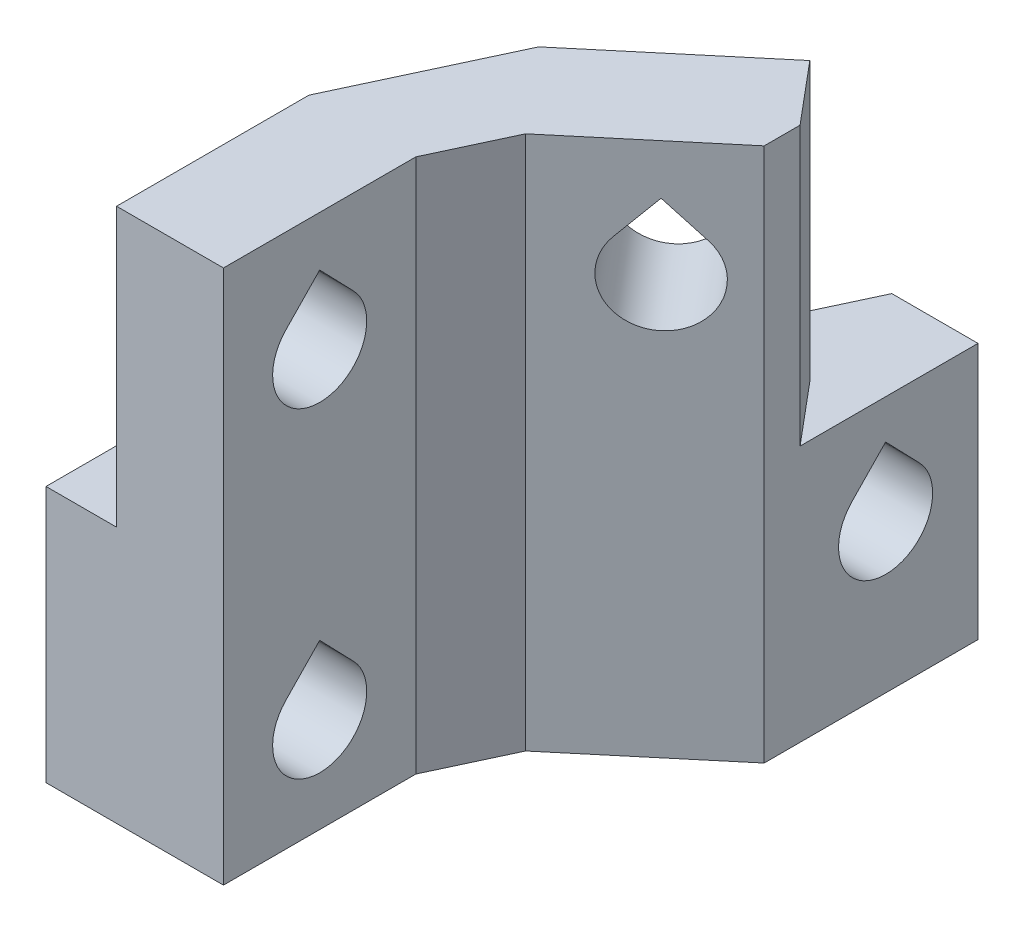
ISO-10303-21;
HEADER;
FILE_DESCRIPTION(('STEP AP214'),'2;1');
FILE_NAME('part.step','',(''),(''),'','','');
FILE_SCHEMA(('AUTOMOTIVE_DESIGN { 1 0 10303 214 1 1 1 1 }'));
ENDSEC;
DATA;
#1=APPLICATION_CONTEXT('core data for automotive mechanical design processes');
#2=APPLICATION_PROTOCOL_DEFINITION('international standard','automotive_design',2000,#1);
#3=PRODUCT_CONTEXT('',#1,'mechanical');
#4=PRODUCT('Part','Part','',(#3));
#5=PRODUCT_RELATED_PRODUCT_CATEGORY('part','',(#4));
#6=PRODUCT_DEFINITION_FORMATION('','',#4);
#7=PRODUCT_DEFINITION_CONTEXT('part definition',#1,'design');
#8=PRODUCT_DEFINITION('design','',#6,#7);
#9=PRODUCT_DEFINITION_SHAPE('','',#8);
#10=(LENGTH_UNIT() NAMED_UNIT(*) SI_UNIT(.MILLI.,.METRE.));
#11=(NAMED_UNIT(*) PLANE_ANGLE_UNIT() SI_UNIT($,.RADIAN.));
#12=(NAMED_UNIT(*) SI_UNIT($,.STERADIAN.) SOLID_ANGLE_UNIT());
#13=UNCERTAINTY_MEASURE_WITH_UNIT(LENGTH_MEASURE(1.E-05),#10,'distance_accuracy_value','');
#14=(GEOMETRIC_REPRESENTATION_CONTEXT(3) GLOBAL_UNCERTAINTY_ASSIGNED_CONTEXT((#13)) GLOBAL_UNIT_ASSIGNED_CONTEXT((#10,
#11,#12)) REPRESENTATION_CONTEXT('',''));
#15=CARTESIAN_POINT('',(0.,0.,0.));
#16=DIRECTION('',(0.,0.,1.));
#17=DIRECTION('',(1.,0.,0.));
#18=AXIS2_PLACEMENT_3D('',#15,#16,#17);
#19=CARTESIAN_POINT('',(16.,-5.,14.9999999999996));
#20=DIRECTION('',(0.,-1.,0.));
#21=DIRECTION('',(0.,0.,-1.));
#22=AXIS2_PLACEMENT_3D('',#19,#20,#21);
#23=PLANE('',#22);
#24=DIRECTION('',(-0.766044443118978,0.,0.64278760968654));
#25=VECTOR('',#24,1.);
#26=CARTESIAN_POINT('',(6.71746577067944,-5.,-1.32877899582662));
#27=LINE('',#26,#25);
#28=CARTESIAN_POINT('',(13.6118657587502,-5.,-7.11386748300547));
#29=VERTEX_POINT('',#28);
#30=CARTESIAN_POINT('',(6.71746577067944,-5.,-1.32877899582662));
#31=VERTEX_POINT('',#30);
#32=EDGE_CURVE('E404',#29,#31,#27,.T.);
#33=ORIENTED_EDGE('',*,*,#32,.F.);
#34=DIRECTION('',(-0.642787609686539,0.,-0.766044443118978));
#35=VECTOR('',#34,1.);
#36=CARTESIAN_POINT('',(13.6118657587502,-5.,-7.11386748300547));
#37=LINE('',#36,#35);
#38=CARTESIAN_POINT('',(16.,-5.,-4.26779992139882));
#39=VERTEX_POINT('',#38);
#40=EDGE_CURVE('E334',#39,#29,#37,.T.);
#41=ORIENTED_EDGE('',*,*,#40,.F.);
#42=DIRECTION('',(0.,0.,1.));
#43=VECTOR('',#42,1.);
#44=CARTESIAN_POINT('',(16.,-5.,-12.5907135973796));
#45=LINE('',#44,#43);
#46=CARTESIAN_POINT('',(16.,-5.,-12.5907135973796));
#47=VERTEX_POINT('',#46);
#48=EDGE_CURVE('E386',#47,#39,#45,.T.);
#49=ORIENTED_EDGE('',*,*,#48,.F.);
#50=DIRECTION('',(1.,0.,0.));
#51=VECTOR('',#50,1.);
#52=CARTESIAN_POINT('',(11.9689921210243,-5.,-12.5907135973796));
#53=LINE('',#52,#51);
#54=CARTESIAN_POINT('',(11.9689921210243,-5.,-12.5907135973796));
#55=VERTEX_POINT('',#54);
#56=EDGE_CURVE('E381',#55,#47,#53,.T.);
#57=ORIENTED_EDGE('',*,*,#56,.F.);
#58=DIRECTION('',(0.422618261740698,0.,-0.906307787036651));
#59=VECTOR('',#58,1.);
#60=CARTESIAN_POINT('',(3.3,-5.,5.99999999999999));
#61=LINE('',#60,#59);
#62=EDGE_CURVE('E417',#31,#55,#61,.T.);
#63=ORIENTED_EDGE('',*,*,#62,.F.);
#64=EDGE_LOOP('',(#33,#41,#49,#57,#63));
#65=FACE_BOUND('',#64,.T.);
#66=ADVANCED_FACE('F30',(#65),#23,.F.);
#67=CARTESIAN_POINT('',(16.,-5.,-12.5907135973796));
#68=DIRECTION('',(1.,0.,0.));
#69=DIRECTION('',(0.,0.,-1.));
#70=AXIS2_PLACEMENT_3D('',#67,#68,#69);
#71=PLANE('',#70);
#72=CARTESIAN_POINT('',(16.,-10.,-8.26977078028226));
#73=DIRECTION('',(1.,0.,0.));
#74=DIRECTION('',(0.,0.,-1.));
#75=AXIS2_PLACEMENT_3D('',#72,#73,#74);
#76=CIRCLE('',#75,2.2);
#77=CARTESIAN_POINT('',(16.,-8.47175158499021,-6.68722321953723));
#78=VERTEX_POINT('',#77);
#79=CARTESIAN_POINT('',(16.,-8.47175158499021,-9.85231834102729));
#80=VERTEX_POINT('',#79);
#81=EDGE_CURVE('E219',#78,#80,#76,.T.);
#82=ORIENTED_EDGE('',*,*,#81,.F.);
#83=DIRECTION('',(0.,-0.71933980033865,0.694658370458998));
#84=VECTOR('',#83,1.);
#85=CARTESIAN_POINT('',(16.,-6.83297561282341,-8.26977078028226));
#86=LINE('',#85,#84);
#87=CARTESIAN_POINT('',(16.,-6.83297561282341,-8.26977078028226));
#88=VERTEX_POINT('',#87);
#89=EDGE_CURVE('E204',#88,#78,#86,.T.);
#90=ORIENTED_EDGE('',*,*,#89,.F.);
#91=DIRECTION('',(0.,0.71933980033865,0.694658370458998));
#92=VECTOR('',#91,1.);
#93=CARTESIAN_POINT('',(16.,-8.47175158499021,-9.85231834102729));
#94=LINE('',#93,#92);
#95=EDGE_CURVE('E215',#80,#88,#94,.T.);
#96=ORIENTED_EDGE('',*,*,#95,.F.);
#97=EDGE_LOOP('',(#82,#90,#96));
#98=FACE_BOUND('',#97,.T.);
#99=DIRECTION('',(0.,-1.,0.));
#100=VECTOR('',#99,1.);
#101=CARTESIAN_POINT('',(16.,8.000025,-2.59071359737859));
#102=LINE('',#101,#100);
#103=CARTESIAN_POINT('',(16.,8.,-2.59071359737859));
#104=VERTEX_POINT('',#103);
#105=CARTESIAN_POINT('',(16.,-17.,-2.59071359737859));
#106=VERTEX_POINT('',#105);
#107=EDGE_CURVE('E296',#104,#106,#102,.T.);
#108=ORIENTED_EDGE('',*,*,#107,.T.);
#109=DIRECTION('',(0.,0.,1.));
#110=VECTOR('',#109,1.);
#111=CARTESIAN_POINT('',(16.,-17.,-12.5907135973796));
#112=LINE('',#111,#110);
#113=CARTESIAN_POINT('',(16.,-17.,-12.5907135973796));
#114=VERTEX_POINT('',#113);
#115=EDGE_CURVE('E368',#114,#106,#112,.T.);
#116=ORIENTED_EDGE('',*,*,#115,.F.);
#117=DIRECTION('',(0.,-1.,0.));
#118=VECTOR('',#117,1.);
#119=CARTESIAN_POINT('',(16.,-5.,-12.5907135973796));
#120=LINE('',#119,#118);
#121=EDGE_CURVE('E340',#47,#114,#120,.T.);
#122=ORIENTED_EDGE('',*,*,#121,.F.);
#123=ORIENTED_EDGE('',*,*,#48,.T.);
#124=DIRECTION('',(0.,-1.,0.));
#125=VECTOR('',#124,1.);
#126=CARTESIAN_POINT('',(16.,8.,-4.26779992139882));
#127=LINE('',#126,#125);
#128=CARTESIAN_POINT('',(16.,8.,-4.26779992139882));
#129=VERTEX_POINT('',#128);
#130=EDGE_CURVE('E373',#129,#39,#127,.T.);
#131=ORIENTED_EDGE('',*,*,#130,.F.);
#132=DIRECTION('',(0.,0.,-1.));
#133=VECTOR('',#132,1.);
#134=CARTESIAN_POINT('',(16.,8.,-4.26779992139882));
#135=LINE('',#134,#133);
#136=EDGE_CURVE('E408',#104,#129,#135,.T.);
#137=ORIENTED_EDGE('',*,*,#136,.F.);
#138=EDGE_LOOP('',(#108,#116,#122,#123,#131,#137));
#139=FACE_BOUND('',#138,.T.);
#140=ADVANCED_FACE('F221',(#98,#139),#71,.T.);
#141=CARTESIAN_POINT('',(11.9689921210243,-5.,-12.5907135973796));
#142=DIRECTION('',(0.,0.,-1.));
#143=DIRECTION('',(-1.,0.,0.));
#144=AXIS2_PLACEMENT_3D('',#141,#142,#143);
#145=PLANE('',#144);
#146=DIRECTION('',(1.,0.,0.));
#147=VECTOR('',#146,1.);
#148=CARTESIAN_POINT('',(11.9689921210243,-17.,-12.5907135973796));
#149=LINE('',#148,#147);
#150=CARTESIAN_POINT('',(11.9689921210243,-17.,-12.5907135973796));
#151=VERTEX_POINT('',#150);
#152=EDGE_CURVE('E371',#151,#114,#149,.T.);
#153=ORIENTED_EDGE('',*,*,#152,.F.);
#154=DIRECTION('',(0.,-1.,0.));
#155=VECTOR('',#154,1.);
#156=CARTESIAN_POINT('',(11.9689921210243,-5.,-12.5907135973796));
#157=LINE('',#156,#155);
#158=EDGE_CURVE('E388',#55,#151,#157,.T.);
#159=ORIENTED_EDGE('',*,*,#158,.F.);
#160=ORIENTED_EDGE('',*,*,#56,.T.);
#161=ORIENTED_EDGE('',*,*,#121,.T.);
#162=EDGE_LOOP('',(#153,#159,#160,#161));
#163=FACE_BOUND('',#162,.T.);
#164=ADVANCED_FACE('F470',(#163),#145,.T.);
#165=CARTESIAN_POINT('',(3.3,-5.,5.99999999999999));
#166=DIRECTION('',(-0.906307787036651,0.,-0.422618261740698));
#167=DIRECTION('',(-0.422618261740698,0.,0.906307787036651));
#168=AXIS2_PLACEMENT_3D('',#165,#166,#167);
#169=PLANE('',#168);
#170=CARTESIAN_POINT('',(9.95410339496202,-10.,-8.26977078028226));
#171=DIRECTION('',(-0.906307787036651,0.,-0.422618261740698));
#172=DIRECTION('',(0.422618261740698,0.,-0.906307787036651));
#173=AXIS2_PLACEMENT_3D('',#170,#171,#172);
#174=ELLIPSE('',#173,2.42743142171748,2.2);
#175=CARTESIAN_POINT('',(10.6920574419319,-8.47175158499021,-9.85231834102729));
#176=VERTEX_POINT('',#175);
#177=CARTESIAN_POINT('',(9.2161493479921,-8.4717515849902,-6.68722321953723));
#178=VERTEX_POINT('',#177);
#179=EDGE_CURVE('E352',#176,#178,#174,.T.);
#180=ORIENTED_EDGE('',*,*,#179,.F.);
#181=DIRECTION('',(0.308160528121496,-0.684332677799278,-0.66085238518443));
#182=VECTOR('',#181,1.);
#183=CARTESIAN_POINT('',(6.02964542374726,1.88207575577133,0.146256498236737));
#184=LINE('',#183,#182);
#185=CARTESIAN_POINT('',(9.95410339496202,-6.83297561282341,-8.26977078028225));
#186=VERTEX_POINT('',#185);
#187=EDGE_CURVE('E342',#186,#176,#184,.T.);
#188=ORIENTED_EDGE('',*,*,#187,.F.);
#189=DIRECTION('',(0.308160528121496,0.684332677799278,-0.66085238518443));
#190=VECTOR('',#189,1.);
#191=CARTESIAN_POINT('',(6.8027370529266,-13.8312209128229,-1.51164385072638));
#192=LINE('',#191,#190);
#193=EDGE_CURVE('E207',#178,#186,#192,.T.);
#194=ORIENTED_EDGE('',*,*,#193,.F.);
#195=EDGE_LOOP('',(#180,#188,#194));
#196=FACE_BOUND('',#195,.T.);
#197=DIRECTION('',(0.422618261740698,0.,-0.906307787036651));
#198=VECTOR('',#197,1.);
#199=CARTESIAN_POINT('',(3.3,-17.,5.99999999999999));
#200=LINE('',#199,#198);
#201=CARTESIAN_POINT('',(3.3,-17.,5.99999999999999));
#202=VERTEX_POINT('',#201);
#203=EDGE_CURVE('E375',#202,#151,#200,.T.);
#204=ORIENTED_EDGE('',*,*,#203,.F.);
#205=DIRECTION('',(0.,-1.,0.));
#206=VECTOR('',#205,1.);
#207=CARTESIAN_POINT('',(3.3,-17.,5.99999999999999));
#208=LINE('',#207,#206);
#209=CARTESIAN_POINT('',(3.3,-5.,5.99999999999999));
#210=VERTEX_POINT('',#209);
#211=EDGE_CURVE('E305',#210,#202,#208,.T.);
#212=ORIENTED_EDGE('',*,*,#211,.F.);
#213=DIRECTION('',(0.,-1.,0.));
#214=VECTOR('',#213,1.);
#215=CARTESIAN_POINT('',(3.3,-5.,5.99999999999999));
#216=LINE('',#215,#214);
#217=CARTESIAN_POINT('',(3.3,8.,6.));
#218=VERTEX_POINT('',#217);
#219=EDGE_CURVE('E319',#218,#210,#216,.T.);
#220=ORIENTED_EDGE('',*,*,#219,.F.);
#221=DIRECTION('',(-0.422618261740698,0.,0.906307787036651));
#222=VECTOR('',#221,1.);
#223=CARTESIAN_POINT('',(3.3,8.,6.));
#224=LINE('',#223,#222);
#225=CARTESIAN_POINT('',(6.71746577067944,8.,-1.32877899582662));
#226=VERTEX_POINT('',#225);
#227=EDGE_CURVE('E438',#226,#218,#224,.T.);
#228=ORIENTED_EDGE('',*,*,#227,.F.);
#229=DIRECTION('',(0.,-1.,0.));
#230=VECTOR('',#229,1.);
#231=CARTESIAN_POINT('',(6.71746577067944,8.,-1.32877899582662));
#232=LINE('',#231,#230);
#233=EDGE_CURVE('E400',#226,#31,#232,.T.);
#234=ORIENTED_EDGE('',*,*,#233,.T.);
#235=ORIENTED_EDGE('',*,*,#62,.T.);
#236=ORIENTED_EDGE('',*,*,#158,.T.);
#237=EDGE_LOOP('',(#204,#212,#220,#228,#234,#235,#236));
#238=FACE_BOUND('',#237,.T.);
#239=ADVANCED_FACE('F473',(#196,#238),#169,.T.);
#240=CARTESIAN_POINT('',(3.3,-5.,14.9999999999996));
#241=DIRECTION('',(-1.,0.,0.));
#242=DIRECTION('',(0.,0.,1.));
#243=AXIS2_PLACEMENT_3D('',#240,#241,#242);
#244=PLANE('',#243);
#245=CARTESIAN_POINT('',(3.3,2.5,10.5));
#246=DIRECTION('',(-1.,0.,0.));
#247=DIRECTION('',(0.,0.,1.));
#248=AXIS2_PLACEMENT_3D('',#245,#246,#247);
#249=CIRCLE('',#248,2.2);
#250=CARTESIAN_POINT('',(3.3,4.02824841500962,8.91745243925479));
#251=VERTEX_POINT('',#250);
#252=CARTESIAN_POINT('',(3.3,4.0282484150098,12.082547560745));
#253=VERTEX_POINT('',#252);
#254=EDGE_CURVE('E272',#251,#253,#249,.T.);
#255=ORIENTED_EDGE('',*,*,#254,.F.);
#256=DIRECTION('',(0.,-0.719339800338728,-0.694658370458918));
#257=VECTOR('',#256,1.);
#258=CARTESIAN_POINT('',(3.3,2.39600466316718,7.34121297035192));
#259=LINE('',#258,#257);
#260=CARTESIAN_POINT('',(3.3,5.66702438717678,10.4999999999998));
#261=VERTEX_POINT('',#260);
#262=EDGE_CURVE('E263',#261,#251,#259,.T.);
#263=ORIENTED_EDGE('',*,*,#262,.F.);
#264=DIRECTION('',(0.,0.719339800338651,-0.694658370458997));
#265=VECTOR('',#264,1.);
#266=CARTESIAN_POINT('',(3.3,-2.10125405841737,18.0017392944858));
#267=LINE('',#266,#265);
#268=EDGE_CURVE('E269',#253,#261,#267,.T.);
#269=ORIENTED_EDGE('',*,*,#268,.F.);
#270=EDGE_LOOP('',(#255,#263,#269));
#271=FACE_BOUND('',#270,.T.);
#272=DIRECTION('',(0.,0.,-1.));
#273=VECTOR('',#272,1.);
#274=CARTESIAN_POINT('',(3.3,-5.,5.99999999999999));
#275=LINE('',#274,#273);
#276=CARTESIAN_POINT('',(3.3,-5.,14.9999999999996));
#277=VERTEX_POINT('',#276);
#278=EDGE_CURVE('E299',#277,#210,#275,.T.);
#279=ORIENTED_EDGE('',*,*,#278,.F.);
#280=DIRECTION('',(0.,-1.,0.));
#281=VECTOR('',#280,1.);
#282=CARTESIAN_POINT('',(3.3,-5.,14.9999999999996));
#283=LINE('',#282,#281);
#284=CARTESIAN_POINT('',(3.3,8.,14.9999999999996));
#285=VERTEX_POINT('',#284);
#286=EDGE_CURVE('E395',#285,#277,#283,.T.);
#287=ORIENTED_EDGE('',*,*,#286,.F.);
#288=DIRECTION('',(0.,0.,1.));
#289=VECTOR('',#288,1.);
#290=CARTESIAN_POINT('',(3.3,8.,14.9999999999996));
#291=LINE('',#290,#289);
#292=EDGE_CURVE('E441',#218,#285,#291,.T.);
#293=ORIENTED_EDGE('',*,*,#292,.F.);
#294=ORIENTED_EDGE('',*,*,#219,.T.);
#295=EDGE_LOOP('',(#279,#287,#293,#294));
#296=FACE_BOUND('',#295,.T.);
#297=ADVANCED_FACE('F475',(#271,#296),#244,.T.);
#298=CARTESIAN_POINT('',(16.,-5.,14.9999999999996));
#299=DIRECTION('',(0.,0.,1.));
#300=DIRECTION('',(1.,0.,0.));
#301=AXIS2_PLACEMENT_3D('',#298,#299,#300);
#302=PLANE('',#301);
#303=DIRECTION('',(0.,-1.,0.));
#304=VECTOR('',#303,1.);
#305=CARTESIAN_POINT('',(8.3,8.000025,14.9999999999996));
#306=LINE('',#305,#304);
#307=CARTESIAN_POINT('',(8.3,8.,14.9999999999996));
#308=VERTEX_POINT('',#307);
#309=CARTESIAN_POINT('',(8.3,-17.,14.9999999999996));
#310=VERTEX_POINT('',#309);
#311=EDGE_CURVE('E295',#308,#310,#306,.T.);
#312=ORIENTED_EDGE('',*,*,#311,.F.);
#313=DIRECTION('',(1.,0.,0.));
#314=VECTOR('',#313,1.);
#315=CARTESIAN_POINT('',(16.,8.,14.9999999999996));
#316=LINE('',#315,#314);
#317=EDGE_CURVE('E403',#285,#308,#316,.T.);
#318=ORIENTED_EDGE('',*,*,#317,.F.);
#319=ORIENTED_EDGE('',*,*,#286,.T.);
#320=DIRECTION('',(1.,0.,0.));
#321=VECTOR('',#320,1.);
#322=CARTESIAN_POINT('',(0.,-5.,14.9999999999996));
#323=LINE('',#322,#321);
#324=CARTESIAN_POINT('',(0.,-5.,14.9999999999996));
#325=VERTEX_POINT('',#324);
#326=EDGE_CURVE('E325',#325,#277,#323,.T.);
#327=ORIENTED_EDGE('',*,*,#326,.F.);
#328=DIRECTION('',(0.,1.,0.));
#329=VECTOR('',#328,1.);
#330=CARTESIAN_POINT('',(0.,-5.,14.9999999999996));
#331=LINE('',#330,#329);
#332=CARTESIAN_POINT('',(0.,-17.,14.9999999999996));
#333=VERTEX_POINT('',#332);
#334=EDGE_CURVE('E304',#333,#325,#331,.T.);
#335=ORIENTED_EDGE('',*,*,#334,.F.);
#336=DIRECTION('',(-1.,0.,0.));
#337=VECTOR('',#336,1.);
#338=CARTESIAN_POINT('',(16.,-17.,14.9999999999996));
#339=LINE('',#338,#337);
#340=EDGE_CURVE('E372',#310,#333,#339,.T.);
#341=ORIENTED_EDGE('',*,*,#340,.F.);
#342=EDGE_LOOP('',(#312,#318,#319,#327,#335,#341));
#343=FACE_BOUND('',#342,.T.);
#344=ADVANCED_FACE('F451',(#343),#302,.T.);
#345=CARTESIAN_POINT('',(16.,-17.,14.9999999999996));
#346=DIRECTION('',(0.,-1.,0.));
#347=DIRECTION('',(0.,0.,-1.));
#348=AXIS2_PLACEMENT_3D('',#345,#346,#347);
#349=PLANE('',#348);
#350=DIRECTION('',(0.766044443118978,0.,-0.642787609686539));
#351=VECTOR('',#350,1.);
#352=CARTESIAN_POINT('',(8.3,-17.,3.87035356268647));
#353=LINE('',#352,#351);
#354=CARTESIAN_POINT('',(9.93140381911214,-17.,2.50144321976827));
#355=VERTEX_POINT('',#354);
#356=EDGE_CURVE('E292',#355,#106,#353,.T.);
#357=ORIENTED_EDGE('',*,*,#356,.F.);
#358=DIRECTION('',(0.422618261740699,0.,-0.90630778703665));
#359=VECTOR('',#358,1.);
#360=CARTESIAN_POINT('',(9.93140381911214,-17.,2.50144321976827));
#361=LINE('',#360,#359);
#362=CARTESIAN_POINT('',(8.3,-17.,5.99999999999997));
#363=VERTEX_POINT('',#362);
#364=EDGE_CURVE('E38',#355,#363,#361,.F.);
#365=ORIENTED_EDGE('',*,*,#364,.T.);
#366=DIRECTION('',(0.,0.,-1.));
#367=VECTOR('',#366,1.);
#368=CARTESIAN_POINT('',(8.3,-17.,14.9999999999996));
#369=LINE('',#368,#367);
#370=EDGE_CURVE('E290',#310,#363,#369,.T.);
#371=ORIENTED_EDGE('',*,*,#370,.F.);
#372=ORIENTED_EDGE('',*,*,#340,.T.);
#373=DIRECTION('',(0.,0.,1.));
#374=VECTOR('',#373,1.);
#375=CARTESIAN_POINT('',(0.,-17.,14.9999999999996));
#376=LINE('',#375,#374);
#377=CARTESIAN_POINT('',(0.,-17.,5.99999999999999));
#378=VERTEX_POINT('',#377);
#379=EDGE_CURVE('E301',#378,#333,#376,.T.);
#380=ORIENTED_EDGE('',*,*,#379,.F.);
#381=DIRECTION('',(1.,0.,0.));
#382=VECTOR('',#381,1.);
#383=CARTESIAN_POINT('',(0.,-17.,5.99999999999999));
#384=LINE('',#383,#382);
#385=EDGE_CURVE('E311',#378,#202,#384,.T.);
#386=ORIENTED_EDGE('',*,*,#385,.T.);
#387=ORIENTED_EDGE('',*,*,#203,.T.);
#388=ORIENTED_EDGE('',*,*,#152,.T.);
#389=ORIENTED_EDGE('',*,*,#115,.T.);
#390=EDGE_LOOP('',(#357,#365,#371,#372,#380,#386,#387,#388,#389));
#391=FACE_BOUND('',#390,.T.);
#392=ADVANCED_FACE('F365',(#391),#349,.T.);
#393=CARTESIAN_POINT('',(13.6118657587502,8.,-7.11386748300547));
#394=DIRECTION('',(-0.766044443118978,0.,0.642787609686539));
#395=DIRECTION('',(0.642787609686539,0.,0.766044443118978));
#396=AXIS2_PLACEMENT_3D('',#393,#394,#395);
#397=PLANE('',#396);
#398=ORIENTED_EDGE('',*,*,#40,.T.);
#399=DIRECTION('',(0.,-1.,0.));
#400=VECTOR('',#399,1.);
#401=CARTESIAN_POINT('',(13.6118657587502,8.,-7.11386748300547));
#402=LINE('',#401,#400);
#403=CARTESIAN_POINT('',(13.6118657587502,8.,-7.11386748300547));
#404=VERTEX_POINT('',#403);
#405=EDGE_CURVE('E378',#404,#29,#402,.T.);
#406=ORIENTED_EDGE('',*,*,#405,.F.);
#407=DIRECTION('',(-0.642787609686539,0.,-0.766044443118978));
#408=VECTOR('',#407,1.);
#409=CARTESIAN_POINT('',(13.6118657587502,8.,-7.11386748300547));
#410=LINE('',#409,#408);
#411=EDGE_CURVE('E439',#129,#404,#410,.T.);
#412=ORIENTED_EDGE('',*,*,#411,.F.);
#413=ORIENTED_EDGE('',*,*,#130,.T.);
#414=EDGE_LOOP('',(#398,#406,#412,#413));
#415=FACE_BOUND('',#414,.T.);
#416=ADVANCED_FACE('F424',(#415),#397,.F.);
#417=CARTESIAN_POINT('',(6.71746577067944,8.,-1.32877899582662));
#418=DIRECTION('',(0.64278760968654,0.,0.766044443118978));
#419=DIRECTION('',(0.766044443118978,0.,-0.64278760968654));
#420=AXIS2_PLACEMENT_3D('',#417,#418,#419);
#421=PLANE('',#420);
#422=DIRECTION('',(-0.5321391845562,-0.71933980033865,0.446517793496086));
#423=VECTOR('',#422,1.);
#424=CARTESIAN_POINT('',(9.3942696576259,4.62557507047582,-3.5748841500973));
#425=LINE('',#424,#423);
#426=CARTESIAN_POINT('',(10.164692745414,5.6670243871766,-4.22134587891074));
#427=VERTEX_POINT('',#426);
#428=CARTESIAN_POINT('',(8.95239098053375,4.0282484150098,-3.20410391512418));
#429=VERTEX_POINT('',#428);
#430=EDGE_CURVE('E246',#427,#429,#425,.T.);
#431=ORIENTED_EDGE('',*,*,#430,.T.);
#432=CARTESIAN_POINT('',(10.164692745414,2.5,-4.22134587891074));
#433=DIRECTION('',(0.64278760968654,0.,0.766044443118978));
#434=DIRECTION('',(0.766044443118978,0.,-0.64278760968654));
#435=AXIS2_PLACEMENT_3D('',#432,#433,#434);
#436=CIRCLE('',#435,2.2);
#437=CARTESIAN_POINT('',(11.3769945102942,4.0282484150098,-5.23858784269731));
#438=VERTEX_POINT('',#437);
#439=EDGE_CURVE('E249',#429,#438,#436,.T.);
#440=ORIENTED_EDGE('',*,*,#439,.T.);
#441=DIRECTION('',(-0.5321391845562,0.719339800338651,0.446517793496086));
#442=VECTOR('',#441,1.);
#443=CARTESIAN_POINT('',(7.60819534490503,9.12286899140752,-2.07618985303801));
#444=LINE('',#443,#442);
#445=EDGE_CURVE('E239',#438,#427,#444,.T.);
#446=ORIENTED_EDGE('',*,*,#445,.T.);
#447=EDGE_LOOP('',(#431,#440,#446));
#448=FACE_BOUND('',#447,.T.);
#449=ORIENTED_EDGE('',*,*,#32,.T.);
#450=ORIENTED_EDGE('',*,*,#233,.F.);
#451=DIRECTION('',(-0.766044443118978,0.,0.64278760968654));
#452=VECTOR('',#451,1.);
#453=CARTESIAN_POINT('',(6.71746577067944,8.,-1.32877899582662));
#454=LINE('',#453,#452);
#455=EDGE_CURVE('E434',#404,#226,#454,.T.);
#456=ORIENTED_EDGE('',*,*,#455,.F.);
#457=ORIENTED_EDGE('',*,*,#405,.T.);
#458=EDGE_LOOP('',(#449,#450,#456,#457));
#459=FACE_BOUND('',#458,.T.);
#460=ADVANCED_FACE('F432',(#448,#459),#421,.F.);
#461=CARTESIAN_POINT('',(16.,8.,14.9999999999996));
#462=DIRECTION('',(0.,-1.,0.));
#463=DIRECTION('',(0.,0.,-1.));
#464=AXIS2_PLACEMENT_3D('',#461,#462,#463);
#465=PLANE('',#464);
#466=DIRECTION('',(0.,0.,-1.));
#467=VECTOR('',#466,1.);
#468=CARTESIAN_POINT('',(8.3,8.,14.9999999999996));
#469=LINE('',#468,#467);
#470=CARTESIAN_POINT('',(8.3,8.,5.99999999999997));
#471=VERTEX_POINT('',#470);
#472=EDGE_CURVE('E337',#308,#471,#469,.T.);
#473=ORIENTED_EDGE('',*,*,#472,.T.);
#474=DIRECTION('',(-0.422618261740699,0.,0.90630778703665));
#475=VECTOR('',#474,1.);
#476=CARTESIAN_POINT('',(6.22806770867155,8.,10.4432731375811));
#477=LINE('',#476,#475);
#478=CARTESIAN_POINT('',(9.93140381911214,8.,2.50144321976827));
#479=VERTEX_POINT('',#478);
#480=EDGE_CURVE('E11',#471,#479,#477,.F.);
#481=ORIENTED_EDGE('',*,*,#480,.T.);
#482=DIRECTION('',(0.766044443118978,0.,-0.642787609686539));
#483=VECTOR('',#482,1.);
#484=CARTESIAN_POINT('',(7.33826443414233,8.,4.67734552128772));
#485=LINE('',#484,#483);
#486=EDGE_CURVE('E339',#479,#104,#485,.T.);
#487=ORIENTED_EDGE('',*,*,#486,.T.);
#488=ORIENTED_EDGE('',*,*,#136,.T.);
#489=ORIENTED_EDGE('',*,*,#411,.T.);
#490=ORIENTED_EDGE('',*,*,#455,.T.);
#491=ORIENTED_EDGE('',*,*,#227,.T.);
#492=ORIENTED_EDGE('',*,*,#292,.T.);
#493=ORIENTED_EDGE('',*,*,#317,.T.);
#494=EDGE_LOOP('',(#473,#481,#487,#488,#489,#490,#491,#492,#493));
#495=FACE_BOUND('',#494,.T.);
#496=ADVANCED_FACE('F448',(#495),#465,.F.);
#497=CARTESIAN_POINT('',(0.,-5.,5.99999999999999));
#498=DIRECTION('',(0.,-1.,0.));
#499=DIRECTION('',(0.,0.,-1.));
#500=AXIS2_PLACEMENT_3D('',#497,#498,#499);
#501=PLANE('',#500);
#502=ORIENTED_EDGE('',*,*,#278,.T.);
#503=DIRECTION('',(1.,0.,0.));
#504=VECTOR('',#503,1.);
#505=CARTESIAN_POINT('',(0.,-5.,5.99999999999999));
#506=LINE('',#505,#504);
#507=CARTESIAN_POINT('',(0.,-5.,5.99999999999999));
#508=VERTEX_POINT('',#507);
#509=EDGE_CURVE('E322',#508,#210,#506,.T.);
#510=ORIENTED_EDGE('',*,*,#509,.F.);
#511=DIRECTION('',(0.,0.,-1.));
#512=VECTOR('',#511,1.);
#513=CARTESIAN_POINT('',(0.,-5.,5.99999999999999));
#514=LINE('',#513,#512);
#515=EDGE_CURVE('E307',#325,#508,#514,.T.);
#516=ORIENTED_EDGE('',*,*,#515,.F.);
#517=ORIENTED_EDGE('',*,*,#326,.T.);
#518=EDGE_LOOP('',(#502,#510,#516,#517));
#519=FACE_BOUND('',#518,.T.);
#520=ADVANCED_FACE('F477',(#519),#501,.F.);
#521=CARTESIAN_POINT('',(0.,-17.,5.99999999999999));
#522=DIRECTION('',(0.,0.,1.));
#523=DIRECTION('',(0.,-1.,0.));
#524=AXIS2_PLACEMENT_3D('',#521,#522,#523);
#525=PLANE('',#524);
#526=ORIENTED_EDGE('',*,*,#211,.T.);
#527=ORIENTED_EDGE('',*,*,#385,.F.);
#528=DIRECTION('',(0.,-1.,0.));
#529=VECTOR('',#528,1.);
#530=CARTESIAN_POINT('',(0.,-17.,5.99999999999999));
#531=LINE('',#530,#529);
#532=EDGE_CURVE('E309',#508,#378,#531,.T.);
#533=ORIENTED_EDGE('',*,*,#532,.F.);
#534=ORIENTED_EDGE('',*,*,#509,.T.);
#535=EDGE_LOOP('',(#526,#527,#533,#534));
#536=FACE_BOUND('',#535,.T.);
#537=ADVANCED_FACE('F465',(#536),#525,.F.);
#538=CARTESIAN_POINT('',(0.,-17.,5.99999999999999));
#539=DIRECTION('',(1.,0.,0.));
#540=DIRECTION('',(0.,0.,-1.));
#541=AXIS2_PLACEMENT_3D('',#538,#539,#540);
#542=PLANE('',#541);
#543=DIRECTION('',(0.,-0.719339800338651,0.694658370458998));
#544=VECTOR('',#543,1.);
#545=CARTESIAN_POINT('',(0.,-11.0516460917779,12.1597007891186));
#546=LINE('',#545,#544);
#547=CARTESIAN_POINT('',(0.,-9.33297561282327,10.4999999999998));
#548=VERTEX_POINT('',#547);
#549=CARTESIAN_POINT('',(0.,-10.9717515849902,12.082547560745));
#550=VERTEX_POINT('',#549);
#551=EDGE_CURVE('E345',#548,#550,#546,.T.);
#552=ORIENTED_EDGE('',*,*,#551,.T.);
#553=CARTESIAN_POINT('',(0.,-12.5,10.5));
#554=DIRECTION('',(1.,0.,0.));
#555=DIRECTION('',(0.,0.,-1.));
#556=AXIS2_PLACEMENT_3D('',#553,#554,#555);
#557=CIRCLE('',#556,2.2);
#558=CARTESIAN_POINT('',(0.,-10.9717515849904,8.9174524392548));
#559=VERTEX_POINT('',#558);
#560=EDGE_CURVE('E293',#550,#559,#557,.T.);
#561=ORIENTED_EDGE('',*,*,#560,.T.);
#562=DIRECTION('',(0.,0.719339800338728,0.694658370458918));
#563=VECTOR('',#562,1.);
#564=CARTESIAN_POINT('',(0.,-15.5489048133645,4.49734694604299));
#565=LINE('',#564,#563);
#566=EDGE_CURVE('E289',#559,#548,#565,.T.);
#567=ORIENTED_EDGE('',*,*,#566,.T.);
#568=EDGE_LOOP('',(#552,#561,#567));
#569=FACE_BOUND('',#568,.T.);
#570=ORIENTED_EDGE('',*,*,#379,.T.);
#571=ORIENTED_EDGE('',*,*,#334,.T.);
#572=ORIENTED_EDGE('',*,*,#515,.T.);
#573=ORIENTED_EDGE('',*,*,#532,.T.);
#574=EDGE_LOOP('',(#570,#571,#572,#573));
#575=FACE_BOUND('',#574,.T.);
#576=ADVANCED_FACE('F460',(#569,#575),#542,.F.);
#577=CARTESIAN_POINT('',(8.3,8.000025,3.87035356268647));
#578=DIRECTION('',(-0.642787609686539,0.,-0.766044443118978));
#579=DIRECTION('',(-0.766044443118978,0.,0.642787609686539));
#580=AXIS2_PLACEMENT_3D('',#577,#578,#579);
#581=PLANE('',#580);
#582=DIRECTION('',(-0.5321391845562,0.719339800338651,0.446517793496085));
#583=VECTOR('',#582,1.);
#584=CARTESIAN_POINT('',(14.5909325587269,4.0282484150098,-1.40836562710241));
#585=LINE('',#584,#583);
#586=CARTESIAN_POINT('',(14.5909325587269,4.0282484150098,-1.40836562710241));
#587=VERTEX_POINT('',#586);
#588=CARTESIAN_POINT('',(13.3786307938467,5.6670243871766,-0.391123663315851));
#589=VERTEX_POINT('',#588);
#590=EDGE_CURVE('E230',#587,#589,#585,.T.);
#591=ORIENTED_EDGE('',*,*,#590,.F.);
#592=CARTESIAN_POINT('',(13.3786307938467,2.5,-0.391123663315849));
#593=DIRECTION('',(0.642787609686539,0.,0.766044443118978));
#594=DIRECTION('',(0.766044443118978,0.,-0.642787609686539));
#595=AXIS2_PLACEMENT_3D('',#592,#593,#594);
#596=CIRCLE('',#595,2.2);
#597=CARTESIAN_POINT('',(12.1663290289664,4.0282484150098,0.626118300470714));
#598=VERTEX_POINT('',#597);
#599=EDGE_CURVE('E227',#598,#587,#596,.T.);
#600=ORIENTED_EDGE('',*,*,#599,.F.);
#601=DIRECTION('',(-0.5321391845562,-0.71933980033865,0.446517793496086));
#602=VECTOR('',#601,1.);
#603=CARTESIAN_POINT('',(13.3786307938467,5.6670243871766,-0.391123663315851));
#604=LINE('',#603,#602);
#605=EDGE_CURVE('E233',#589,#598,#604,.T.);
#606=ORIENTED_EDGE('',*,*,#605,.F.);
#607=EDGE_LOOP('',(#591,#600,#606));
#608=FACE_BOUND('',#607,.T.);
#609=ORIENTED_EDGE('',*,*,#486,.F.);
#610=DIRECTION('',(0.,-1.,0.));
#611=VECTOR('',#610,1.);
#612=CARTESIAN_POINT('',(9.93140381911214,-17.,2.50144321976827));
#613=LINE('',#612,#611);
#614=EDGE_CURVE('E354',#479,#355,#613,.T.);
#615=ORIENTED_EDGE('',*,*,#614,.T.);
#616=ORIENTED_EDGE('',*,*,#356,.T.);
#617=ORIENTED_EDGE('',*,*,#107,.F.);
#618=EDGE_LOOP('',(#609,#615,#616,#617));
#619=FACE_BOUND('',#618,.T.);
#620=ADVANCED_FACE('F360',(#608,#619),#581,.F.);
#621=CARTESIAN_POINT('',(8.3,8.000025,14.9999999999996));
#622=DIRECTION('',(-1.,0.,0.));
#623=DIRECTION('',(0.,0.,1.));
#624=AXIS2_PLACEMENT_3D('',#621,#622,#623);
#625=PLANE('',#624);
#626=DIRECTION('',(0.,0.719339800338728,0.694658370458918));
#627=VECTOR('',#626,1.);
#628=CARTESIAN_POINT('',(8.3,4.02824841500962,8.91745243925479));
#629=LINE('',#628,#627);
#630=CARTESIAN_POINT('',(8.3,4.02824841500962,8.91745243925479));
#631=VERTEX_POINT('',#630);
#632=CARTESIAN_POINT('',(8.3,5.66702438717678,10.4999999999998));
#633=VERTEX_POINT('',#632);
#634=EDGE_CURVE('E254',#631,#633,#629,.T.);
#635=ORIENTED_EDGE('',*,*,#634,.F.);
#636=CARTESIAN_POINT('',(8.3,2.5,10.5));
#637=DIRECTION('',(1.,0.,0.));
#638=DIRECTION('',(0.,0.,-1.));
#639=AXIS2_PLACEMENT_3D('',#636,#637,#638);
#640=CIRCLE('',#639,2.2);
#641=CARTESIAN_POINT('',(8.3,4.0282484150098,12.082547560745));
#642=VERTEX_POINT('',#641);
#643=EDGE_CURVE('E252',#642,#631,#640,.T.);
#644=ORIENTED_EDGE('',*,*,#643,.F.);
#645=DIRECTION('',(0.,-0.719339800338651,0.694658370458997));
#646=VECTOR('',#645,1.);
#647=CARTESIAN_POINT('',(8.3,5.66702438717678,10.4999999999998));
#648=LINE('',#647,#646);
#649=EDGE_CURVE('E257',#633,#642,#648,.T.);
#650=ORIENTED_EDGE('',*,*,#649,.F.);
#651=EDGE_LOOP('',(#635,#644,#650));
#652=FACE_BOUND('',#651,.T.);
#653=DIRECTION('',(0.,0.719339800338728,0.694658370458918));
#654=VECTOR('',#653,1.);
#655=CARTESIAN_POINT('',(8.3,-10.9717515849904,8.91745243925479));
#656=LINE('',#655,#654);
#657=CARTESIAN_POINT('',(8.3,-10.9717515849904,8.91745243925479));
#658=VERTEX_POINT('',#657);
#659=CARTESIAN_POINT('',(8.3,-9.33297561282327,10.4999999999998));
#660=VERTEX_POINT('',#659);
#661=EDGE_CURVE('E276',#658,#660,#656,.T.);
#662=ORIENTED_EDGE('',*,*,#661,.F.);
#663=CARTESIAN_POINT('',(8.3,-12.5,10.5));
#664=DIRECTION('',(1.,0.,0.));
#665=DIRECTION('',(0.,0.,-1.));
#666=AXIS2_PLACEMENT_3D('',#663,#664,#665);
#667=CIRCLE('',#666,2.2);
#668=CARTESIAN_POINT('',(8.3,-10.9717515849902,12.082547560745));
#669=VERTEX_POINT('',#668);
#670=EDGE_CURVE('E274',#669,#658,#667,.T.);
#671=ORIENTED_EDGE('',*,*,#670,.F.);
#672=DIRECTION('',(0.,-0.719339800338651,0.694658370458998));
#673=VECTOR('',#672,1.);
#674=CARTESIAN_POINT('',(8.3,-9.33297561282327,10.4999999999998));
#675=LINE('',#674,#673);
#676=EDGE_CURVE('E279',#660,#669,#675,.T.);
#677=ORIENTED_EDGE('',*,*,#676,.F.);
#678=EDGE_LOOP('',(#662,#671,#677));
#679=FACE_BOUND('',#678,.T.);
#680=ORIENTED_EDGE('',*,*,#370,.T.);
#681=DIRECTION('',(0.,1.,0.));
#682=VECTOR('',#681,1.);
#683=CARTESIAN_POINT('',(8.3,8.,5.99999999999997));
#684=LINE('',#683,#682);
#685=EDGE_CURVE('E45',#363,#471,#684,.T.);
#686=ORIENTED_EDGE('',*,*,#685,.T.);
#687=ORIENTED_EDGE('',*,*,#472,.F.);
#688=ORIENTED_EDGE('',*,*,#311,.T.);
#689=EDGE_LOOP('',(#680,#686,#687,#688));
#690=FACE_BOUND('',#689,.T.);
#691=ADVANCED_FACE('F455',(#652,#679,#690),#625,.F.);
#692=CARTESIAN_POINT('',(-2.49999999972494E-05,-12.5,10.5));
#693=DIRECTION('',(1.,0.,0.));
#694=DIRECTION('',(0.,0.,-1.));
#695=AXIS2_PLACEMENT_3D('',#692,#693,#694);
#696=CYLINDRICAL_SURFACE('',#695,2.2);
#697=DIRECTION('',(1.,0.,0.));
#698=VECTOR('',#697,1.);
#699=CARTESIAN_POINT('',(-2.49999999972494E-05,-10.9717515849902,12.082547560745));
#700=LINE('',#699,#698);
#701=EDGE_CURVE('E285',#550,#669,#700,.T.);
#702=ORIENTED_EDGE('',*,*,#701,.T.);
#703=ORIENTED_EDGE('',*,*,#670,.T.);
#704=DIRECTION('',(1.,0.,0.));
#705=VECTOR('',#704,1.);
#706=CARTESIAN_POINT('',(-2.49999999972494E-05,-10.9717515849904,8.9174524392548));
#707=LINE('',#706,#705);
#708=EDGE_CURVE('E282',#559,#658,#707,.T.);
#709=ORIENTED_EDGE('',*,*,#708,.F.);
#710=ORIENTED_EDGE('',*,*,#560,.F.);
#711=EDGE_LOOP('',(#702,#703,#709,#710));
#712=FACE_BOUND('',#711,.T.);
#713=ADVANCED_FACE('F553',(#712),#696,.F.);
#714=CARTESIAN_POINT('',(-2.49999999972494E-05,-9.33297561282327,10.4999999999998));
#715=DIRECTION('',(0.,0.694658370458998,0.719339800338651));
#716=DIRECTION('',(0.,-0.719339800338651,0.694658370458998));
#717=AXIS2_PLACEMENT_3D('',#714,#715,#716);
#718=PLANE('',#717);
#719=DIRECTION('',(1.,0.,0.));
#720=VECTOR('',#719,1.);
#721=CARTESIAN_POINT('',(-2.49999999972494E-05,-9.33297561282327,10.4999999999998));
#722=LINE('',#721,#720);
#723=EDGE_CURVE('E283',#548,#660,#722,.T.);
#724=ORIENTED_EDGE('',*,*,#723,.T.);
#725=ORIENTED_EDGE('',*,*,#676,.T.);
#726=ORIENTED_EDGE('',*,*,#701,.F.);
#727=ORIENTED_EDGE('',*,*,#551,.F.);
#728=EDGE_LOOP('',(#724,#725,#726,#727));
#729=FACE_BOUND('',#728,.T.);
#730=ADVANCED_FACE('F639',(#729),#718,.F.);
#731=CARTESIAN_POINT('',(-2.49999999972494E-05,-10.9717515849904,8.9174524392548));
#732=DIRECTION('',(0.,0.694658370458918,-0.719339800338728));
#733=DIRECTION('',(0.,0.719339800338728,0.694658370458918));
#734=AXIS2_PLACEMENT_3D('',#731,#732,#733);
#735=PLANE('',#734);
#736=ORIENTED_EDGE('',*,*,#708,.T.);
#737=ORIENTED_EDGE('',*,*,#661,.T.);
#738=ORIENTED_EDGE('',*,*,#723,.F.);
#739=ORIENTED_EDGE('',*,*,#566,.F.);
#740=EDGE_LOOP('',(#736,#737,#738,#739));
#741=FACE_BOUND('',#740,.T.);
#742=ADVANCED_FACE('F631',(#741),#735,.F.);
#743=CARTESIAN_POINT('',(-2.49999999972494E-05,2.5,10.5));
#744=DIRECTION('',(1.,0.,0.));
#745=DIRECTION('',(0.,0.,-1.));
#746=AXIS2_PLACEMENT_3D('',#743,#744,#745);
#747=CYLINDRICAL_SURFACE('',#746,2.2);
#748=ORIENTED_EDGE('',*,*,#254,.T.);
#749=DIRECTION('',(1.,0.,0.));
#750=VECTOR('',#749,1.);
#751=CARTESIAN_POINT('',(-2.49999999972494E-05,4.0282484150098,12.082547560745));
#752=LINE('',#751,#750);
#753=EDGE_CURVE('E261',#253,#642,#752,.T.);
#754=ORIENTED_EDGE('',*,*,#753,.T.);
#755=ORIENTED_EDGE('',*,*,#643,.T.);
#756=DIRECTION('',(1.,0.,0.));
#757=VECTOR('',#756,1.);
#758=CARTESIAN_POINT('',(-2.49999999972494E-05,4.02824841500962,8.91745243925479));
#759=LINE('',#758,#757);
#760=EDGE_CURVE('E260',#251,#631,#759,.T.);
#761=ORIENTED_EDGE('',*,*,#760,.F.);
#762=EDGE_LOOP('',(#748,#754,#755,#761));
#763=FACE_BOUND('',#762,.T.);
#764=ADVANCED_FACE('F623',(#763),#747,.F.);
#765=CARTESIAN_POINT('',(-2.49999999972494E-05,5.66702438717678,10.4999999999998));
#766=DIRECTION('',(0.,0.694658370458997,0.719339800338651));
#767=DIRECTION('',(0.,-0.719339800338651,0.694658370458997));
#768=AXIS2_PLACEMENT_3D('',#765,#766,#767);
#769=PLANE('',#768);
#770=ORIENTED_EDGE('',*,*,#268,.T.);
#771=DIRECTION('',(1.,0.,0.));
#772=VECTOR('',#771,1.);
#773=CARTESIAN_POINT('',(-2.49999999972494E-05,5.66702438717678,10.4999999999998));
#774=LINE('',#773,#772);
#775=EDGE_CURVE('E264',#261,#633,#774,.T.);
#776=ORIENTED_EDGE('',*,*,#775,.T.);
#777=ORIENTED_EDGE('',*,*,#649,.T.);
#778=ORIENTED_EDGE('',*,*,#753,.F.);
#779=EDGE_LOOP('',(#770,#776,#777,#778));
#780=FACE_BOUND('',#779,.T.);
#781=ADVANCED_FACE('F615',(#780),#769,.F.);
#782=CARTESIAN_POINT('',(-2.49999999972494E-05,4.02824841500962,8.91745243925479));
#783=DIRECTION('',(0.,0.694658370458918,-0.719339800338728));
#784=DIRECTION('',(0.,0.719339800338728,0.694658370458918));
#785=AXIS2_PLACEMENT_3D('',#782,#783,#784);
#786=PLANE('',#785);
#787=ORIENTED_EDGE('',*,*,#262,.T.);
#788=ORIENTED_EDGE('',*,*,#760,.T.);
#789=ORIENTED_EDGE('',*,*,#634,.T.);
#790=ORIENTED_EDGE('',*,*,#775,.F.);
#791=EDGE_LOOP('',(#787,#788,#789,#790));
#792=FACE_BOUND('',#791,.T.);
#793=ADVANCED_FACE('F608',(#792),#786,.F.);
#794=CARTESIAN_POINT('',(1.8437548106259,2.5,-14.1378535564479));
#795=DIRECTION('',(0.642787609686539,0.,0.766044443118978));
#796=DIRECTION('',(0.766044443118978,0.,-0.642787609686539));
#797=AXIS2_PLACEMENT_3D('',#794,#795,#796);
#798=CYLINDRICAL_SURFACE('',#797,2.2);
#799=DIRECTION('',(0.642787609686539,0.,0.766044443118978));
#800=VECTOR('',#799,1.);
#801=CARTESIAN_POINT('',(0.63145304574567,4.0282484150098,-13.1206115926613));
#802=LINE('',#801,#800);
#803=EDGE_CURVE('E237',#429,#598,#802,.T.);
#804=ORIENTED_EDGE('',*,*,#803,.T.);
#805=ORIENTED_EDGE('',*,*,#599,.T.);
#806=DIRECTION('',(0.642787609686539,0.,0.766044443118978));
#807=VECTOR('',#806,1.);
#808=CARTESIAN_POINT('',(3.05605657550613,4.0282484150098,-15.1550955202344));
#809=LINE('',#808,#807);
#810=EDGE_CURVE('E236',#438,#587,#809,.T.);
#811=ORIENTED_EDGE('',*,*,#810,.F.);
#812=ORIENTED_EDGE('',*,*,#439,.F.);
#813=EDGE_LOOP('',(#804,#805,#811,#812));
#814=FACE_BOUND('',#813,.T.);
#815=ADVANCED_FACE('F601',(#814),#798,.F.);
#816=CARTESIAN_POINT('',(1.8437548106259,5.6670243871766,-14.1378535564479));
#817=DIRECTION('',(-0.551046256763738,0.694658370458998,0.462382710812073));
#818=DIRECTION('',(-0.783437107222808,-0.621471076580687,0.));
#819=AXIS2_PLACEMENT_3D('',#816,#817,#818);
#820=PLANE('',#819);
#821=DIRECTION('',(0.642787609686539,0.,0.766044443118978));
#822=VECTOR('',#821,1.);
#823=CARTESIAN_POINT('',(1.8437548106259,5.6670243871766,-14.1378535564479));
#824=LINE('',#823,#822);
#825=EDGE_CURVE('E240',#427,#589,#824,.T.);
#826=ORIENTED_EDGE('',*,*,#825,.T.);
#827=ORIENTED_EDGE('',*,*,#605,.T.);
#828=ORIENTED_EDGE('',*,*,#803,.F.);
#829=ORIENTED_EDGE('',*,*,#430,.F.);
#830=EDGE_LOOP('',(#826,#827,#828,#829));
#831=FACE_BOUND('',#830,.T.);
#832=ADVANCED_FACE('F592',(#831),#820,.F.);
#833=CARTESIAN_POINT('',(3.05605657550613,4.0282484150098,-15.1550955202344));
#834=DIRECTION('',(0.551046256763738,0.694658370458998,-0.462382710812074));
#835=DIRECTION('',(-0.783437107222808,0.621471076580688,0.));
#836=AXIS2_PLACEMENT_3D('',#833,#834,#835);
#837=PLANE('',#836);
#838=ORIENTED_EDGE('',*,*,#810,.T.);
#839=ORIENTED_EDGE('',*,*,#590,.T.);
#840=ORIENTED_EDGE('',*,*,#825,.F.);
#841=ORIENTED_EDGE('',*,*,#445,.F.);
#842=EDGE_LOOP('',(#838,#839,#840,#841));
#843=FACE_BOUND('',#842,.T.);
#844=ADVANCED_FACE('F583',(#843),#837,.F.);
#845=CARTESIAN_POINT('',(-2.49999999972494E-05,-10.,-8.26977078028226));
#846=DIRECTION('',(1.,0.,0.));
#847=DIRECTION('',(0.,0.,-1.));
#848=AXIS2_PLACEMENT_3D('',#845,#846,#847);
#849=CYLINDRICAL_SURFACE('',#848,2.2);
#850=ORIENTED_EDGE('',*,*,#179,.T.);
#851=DIRECTION('',(1.,0.,0.));
#852=VECTOR('',#851,1.);
#853=CARTESIAN_POINT('',(-2.49999999972494E-05,-8.47175158499021,-6.68722321953723));
#854=LINE('',#853,#852);
#855=EDGE_CURVE('E210',#178,#78,#854,.T.);
#856=ORIENTED_EDGE('',*,*,#855,.T.);
#857=ORIENTED_EDGE('',*,*,#81,.T.);
#858=DIRECTION('',(1.,0.,0.));
#859=VECTOR('',#858,1.);
#860=CARTESIAN_POINT('',(-2.49999999972494E-05,-8.47175158499021,-9.85231834102729));
#861=LINE('',#860,#859);
#862=EDGE_CURVE('E211',#176,#80,#861,.T.);
#863=ORIENTED_EDGE('',*,*,#862,.F.);
#864=EDGE_LOOP('',(#850,#856,#857,#863));
#865=FACE_BOUND('',#864,.T.);
#866=ADVANCED_FACE('F576',(#865),#849,.F.);
#867=CARTESIAN_POINT('',(-2.49999999972494E-05,-6.83297561282341,-8.26977078028226));
#868=DIRECTION('',(0.,0.694658370458998,0.71933980033865));
#869=DIRECTION('',(0.,-0.71933980033865,0.694658370458998));
#870=AXIS2_PLACEMENT_3D('',#867,#868,#869);
#871=PLANE('',#870);
#872=ORIENTED_EDGE('',*,*,#193,.T.);
#873=DIRECTION('',(1.,0.,0.));
#874=VECTOR('',#873,1.);
#875=CARTESIAN_POINT('',(-2.49999999972494E-05,-6.83297561282341,-8.26977078028226));
#876=LINE('',#875,#874);
#877=EDGE_CURVE('E199',#186,#88,#876,.T.);
#878=ORIENTED_EDGE('',*,*,#877,.T.);
#879=ORIENTED_EDGE('',*,*,#89,.T.);
#880=ORIENTED_EDGE('',*,*,#855,.F.);
#881=EDGE_LOOP('',(#872,#878,#879,#880));
#882=FACE_BOUND('',#881,.T.);
#883=ADVANCED_FACE('F201',(#882),#871,.F.);
#884=CARTESIAN_POINT('',(-2.49999999972494E-05,-8.47175158499021,-9.85231834102729));
#885=DIRECTION('',(0.,0.694658370458998,-0.71933980033865));
#886=DIRECTION('',(0.,0.71933980033865,0.694658370458998));
#887=AXIS2_PLACEMENT_3D('',#884,#885,#886);
#888=PLANE('',#887);
#889=ORIENTED_EDGE('',*,*,#187,.T.);
#890=ORIENTED_EDGE('',*,*,#862,.T.);
#891=ORIENTED_EDGE('',*,*,#95,.T.);
#892=ORIENTED_EDGE('',*,*,#877,.F.);
#893=EDGE_LOOP('',(#889,#890,#891,#892));
#894=FACE_BOUND('',#893,.T.);
#895=ADVANCED_FACE('F216',(#894),#888,.F.);
#896=CARTESIAN_POINT('',(9.93140381911214,8.000025,2.50144321976827));
#897=DIRECTION('',(0.90630778703665,0.,0.422618261740699));
#898=DIRECTION('',(0.422618261740699,0.,-0.90630778703665));
#899=AXIS2_PLACEMENT_3D('',#896,#897,#898);
#900=PLANE('',#899);
#901=ORIENTED_EDGE('',*,*,#480,.F.);
#902=ORIENTED_EDGE('',*,*,#685,.F.);
#903=ORIENTED_EDGE('',*,*,#364,.F.);
#904=ORIENTED_EDGE('',*,*,#614,.F.);
#905=EDGE_LOOP('',(#901,#902,#903,#904));
#906=FACE_BOUND('',#905,.T.);
#907=ADVANCED_FACE('F32',(#906),#900,.T.);
#908=CLOSED_SHELL('',(#66,#140,#164,#239,#297,#344,#392,#416,#460,#496,#520,#537,#576,#620,#691,
#713,#730,#742,#764,#781,#793,#815,#832,#844,#866,#883,#895,#907));
#909=MANIFOLD_SOLID_BREP('B2',#908);
#910=ADVANCED_BREP_SHAPE_REPRESENTATION('',(#18,#909),#14);
#911=SHAPE_DEFINITION_REPRESENTATION(#9,#910);
ENDSEC;
END-ISO-10303-21;
